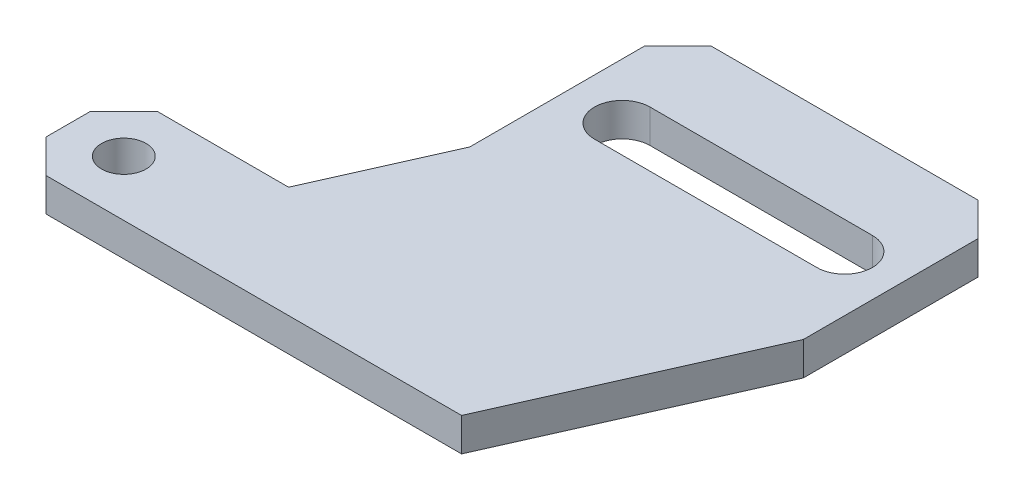
ISO-10303-21;
HEADER;
FILE_DESCRIPTION(('STEP AP214'),'2;1');
FILE_NAME('part.step','',(''),(''),'','','');
FILE_SCHEMA(('AUTOMOTIVE_DESIGN { 1 0 10303 214 1 1 1 1 }'));
ENDSEC;
DATA;
#1=APPLICATION_CONTEXT('core data for automotive mechanical design processes');
#2=APPLICATION_PROTOCOL_DEFINITION('international standard','automotive_design',2000,#1);
#3=PRODUCT_CONTEXT('',#1,'mechanical');
#4=PRODUCT('Part','Part','',(#3));
#5=PRODUCT_RELATED_PRODUCT_CATEGORY('part','',(#4));
#6=PRODUCT_DEFINITION_FORMATION('','',#4);
#7=PRODUCT_DEFINITION_CONTEXT('part definition',#1,'design');
#8=PRODUCT_DEFINITION('design','',#6,#7);
#9=PRODUCT_DEFINITION_SHAPE('','',#8);
#10=(LENGTH_UNIT() NAMED_UNIT(*) SI_UNIT(.MILLI.,.METRE.));
#11=(NAMED_UNIT(*) PLANE_ANGLE_UNIT() SI_UNIT($,.RADIAN.));
#12=(NAMED_UNIT(*) SI_UNIT($,.STERADIAN.) SOLID_ANGLE_UNIT());
#13=UNCERTAINTY_MEASURE_WITH_UNIT(LENGTH_MEASURE(1.E-05),#10,'distance_accuracy_value','');
#14=(GEOMETRIC_REPRESENTATION_CONTEXT(3) GLOBAL_UNCERTAINTY_ASSIGNED_CONTEXT((#13)) GLOBAL_UNIT_ASSIGNED_CONTEXT((#10,
#11,#12)) REPRESENTATION_CONTEXT('',''));
#15=CARTESIAN_POINT('',(0.,0.,0.));
#16=DIRECTION('',(0.,0.,1.));
#17=DIRECTION('',(1.,0.,0.));
#18=AXIS2_PLACEMENT_3D('',#15,#16,#17);
#19=CARTESIAN_POINT('',(0.,3.,0.));
#20=DIRECTION('',(0.,-1.,0.));
#21=DIRECTION('',(0.,0.,-1.));
#22=AXIS2_PLACEMENT_3D('',#19,#20,#21);
#23=PLANE('',#22);
#24=CARTESIAN_POINT('',(-29.8330840746436,3.,5.));
#25=DIRECTION('',(0.,1.,0.));
#26=DIRECTION('',(0.,0.,1.));
#27=AXIS2_PLACEMENT_3D('',#24,#25,#26);
#28=CIRCLE('',#27,2.);
#29=CARTESIAN_POINT('',(-29.8330840746436,3.,7.));
#30=VERTEX_POINT('',#29);
#31=EDGE_CURVE('E217',#30,#30,#28,.T.);
#32=ORIENTED_EDGE('',*,*,#31,.F.);
#33=EDGE_LOOP('',(#32));
#34=FACE_BOUND('',#33,.T.);
#35=DIRECTION('',(0.,0.,1.));
#36=VECTOR('',#35,1.);
#37=CARTESIAN_POINT('',(-34.8330840746436,3.,0.));
#38=LINE('',#37,#36);
#39=CARTESIAN_POINT('',(-34.8330840746436,3.,3.));
#40=VERTEX_POINT('',#39);
#41=CARTESIAN_POINT('',(-34.8330840746436,3.,6.99999999999999));
#42=VERTEX_POINT('',#41);
#43=EDGE_CURVE('E242',#40,#42,#38,.T.);
#44=ORIENTED_EDGE('',*,*,#43,.T.);
#45=DIRECTION('',(-0.707106781186545,0.,-0.70710678118655));
#46=VECTOR('',#45,1.);
#47=CARTESIAN_POINT('',(-31.8330840746436,3.,10.));
#48=LINE('',#47,#46);
#49=CARTESIAN_POINT('',(-31.8330840746436,3.,10.));
#50=VERTEX_POINT('',#49);
#51=EDGE_CURVE('E324',#42,#50,#48,.F.);
#52=ORIENTED_EDGE('',*,*,#51,.T.);
#53=DIRECTION('',(1.,0.,0.));
#54=VECTOR('',#53,1.);
#55=CARTESIAN_POINT('',(-34.8330840746436,3.,10.));
#56=LINE('',#55,#54);
#57=CARTESIAN_POINT('',(5.54714750959376,3.,10.));
#58=VERTEX_POINT('',#57);
#59=EDGE_CURVE('E246',#50,#58,#56,.T.);
#60=ORIENTED_EDGE('',*,*,#59,.T.);
#61=DIRECTION('',(0.405833681073968,0.,-0.913946947752414));
#62=VECTOR('',#61,1.);
#63=CARTESIAN_POINT('',(15.,3.,-11.2880450392829));
#64=LINE('',#63,#62);
#65=CARTESIAN_POINT('',(15.,3.,-11.2880450392829));
#66=VERTEX_POINT('',#65);
#67=EDGE_CURVE('E249',#58,#66,#64,.T.);
#68=ORIENTED_EDGE('',*,*,#67,.T.);
#69=DIRECTION('',(0.,0.,-1.));
#70=VECTOR('',#69,1.);
#71=CARTESIAN_POINT('',(15.,3.,-11.2880450392829));
#72=LINE('',#71,#70);
#73=CARTESIAN_POINT('',(15.,3.,-27.));
#74=VERTEX_POINT('',#73);
#75=EDGE_CURVE('E225',#66,#74,#72,.T.);
#76=ORIENTED_EDGE('',*,*,#75,.T.);
#77=DIRECTION('',(0.707106781186546,0.,0.707106781186549));
#78=VECTOR('',#77,1.);
#79=CARTESIAN_POINT('',(12.,3.,-30.));
#80=LINE('',#79,#78);
#81=CARTESIAN_POINT('',(12.,3.,-30.));
#82=VERTEX_POINT('',#81);
#83=EDGE_CURVE('E318',#74,#82,#80,.F.);
#84=ORIENTED_EDGE('',*,*,#83,.T.);
#85=DIRECTION('',(-1.,0.,0.));
#86=VECTOR('',#85,1.);
#87=CARTESIAN_POINT('',(-15.,3.,-30.));
#88=LINE('',#87,#86);
#89=CARTESIAN_POINT('',(-12.,3.,-30.));
#90=VERTEX_POINT('',#89);
#91=EDGE_CURVE('E229',#82,#90,#88,.T.);
#92=ORIENTED_EDGE('',*,*,#91,.T.);
#93=DIRECTION('',(0.707106781186549,0.,-0.707106781186546));
#94=VECTOR('',#93,1.);
#95=CARTESIAN_POINT('',(-15.,3.,-27.));
#96=LINE('',#95,#94);
#97=CARTESIAN_POINT('',(-15.,3.,-27.));
#98=VERTEX_POINT('',#97);
#99=EDGE_CURVE('E70',#90,#98,#96,.F.);
#100=ORIENTED_EDGE('',*,*,#99,.T.);
#101=DIRECTION('',(0.,0.,1.));
#102=VECTOR('',#101,1.);
#103=CARTESIAN_POINT('',(-15.,3.,-11.2880450392829));
#104=LINE('',#103,#102);
#105=CARTESIAN_POINT('',(-15.,3.,-11.2880450392829));
#106=VERTEX_POINT('',#105);
#107=EDGE_CURVE('E233',#98,#106,#104,.T.);
#108=ORIENTED_EDGE('',*,*,#107,.T.);
#109=DIRECTION('',(-0.405833681073968,0.,0.913946947752413));
#110=VECTOR('',#109,1.);
#111=CARTESIAN_POINT('',(-15.,3.,-11.2880450392829));
#112=LINE('',#111,#110);
#113=CARTESIAN_POINT('',(-20.0124013015052,3.,0.));
#114=VERTEX_POINT('',#113);
#115=EDGE_CURVE('E236',#106,#114,#112,.T.);
#116=ORIENTED_EDGE('',*,*,#115,.T.);
#117=DIRECTION('',(-1.,0.,0.));
#118=VECTOR('',#117,1.);
#119=CARTESIAN_POINT('',(-20.0124013015052,3.,0.));
#120=LINE('',#119,#118);
#121=CARTESIAN_POINT('',(-31.8330840746436,3.,0.));
#122=VERTEX_POINT('',#121);
#123=EDGE_CURVE('E239',#114,#122,#120,.T.);
#124=ORIENTED_EDGE('',*,*,#123,.T.);
#125=DIRECTION('',(0.707106781186548,0.,-0.707106781186547));
#126=VECTOR('',#125,1.);
#127=CARTESIAN_POINT('',(-34.8330840746436,3.,3.));
#128=LINE('',#127,#126);
#129=EDGE_CURVE('E321',#122,#40,#128,.F.);
#130=ORIENTED_EDGE('',*,*,#129,.T.);
#131=EDGE_LOOP('',(#44,#52,#60,#68,#76,#84,#92,#100,#108,#116,#124,#130));
#132=FACE_BOUND('',#131,.T.);
#133=CARTESIAN_POINT('',(-10.,3.,-20.));
#134=DIRECTION('',(0.,1.,0.));
#135=DIRECTION('',(0.,0.,1.));
#136=AXIS2_PLACEMENT_3D('',#133,#134,#135);
#137=CIRCLE('',#136,2.5);
#138=CARTESIAN_POINT('',(-10.,3.,-22.5));
#139=VERTEX_POINT('',#138);
#140=CARTESIAN_POINT('',(-10.,3.,-17.5));
#141=VERTEX_POINT('',#140);
#142=EDGE_CURVE('E164',#139,#141,#137,.T.);
#143=ORIENTED_EDGE('',*,*,#142,.F.);
#144=DIRECTION('',(-1.,0.,0.));
#145=VECTOR('',#144,1.);
#146=CARTESIAN_POINT('',(-10.,3.,-22.5));
#147=LINE('',#146,#145);
#148=CARTESIAN_POINT('',(10.,3.,-22.5));
#149=VERTEX_POINT('',#148);
#150=EDGE_CURVE('E193',#149,#139,#147,.T.);
#151=ORIENTED_EDGE('',*,*,#150,.F.);
#152=CARTESIAN_POINT('',(10.,3.,-20.));
#153=DIRECTION('',(0.,1.,0.));
#154=DIRECTION('',(0.,0.,1.));
#155=AXIS2_PLACEMENT_3D('',#152,#153,#154);
#156=CIRCLE('',#155,2.5);
#157=CARTESIAN_POINT('',(10.,3.,-17.5));
#158=VERTEX_POINT('',#157);
#159=EDGE_CURVE('E189',#158,#149,#156,.T.);
#160=ORIENTED_EDGE('',*,*,#159,.F.);
#161=DIRECTION('',(1.,0.,0.));
#162=VECTOR('',#161,1.);
#163=CARTESIAN_POINT('',(-10.,3.,-17.5));
#164=LINE('',#163,#162);
#165=EDGE_CURVE('E175',#141,#158,#164,.T.);
#166=ORIENTED_EDGE('',*,*,#165,.F.);
#167=EDGE_LOOP('',(#143,#151,#160,#166));
#168=FACE_BOUND('',#167,.T.);
#169=ADVANCED_FACE('F45',(#34,#132,#168),#23,.F.);
#170=CARTESIAN_POINT('',(0.,0.,0.));
#171=DIRECTION('',(0.,-1.,0.));
#172=DIRECTION('',(0.,0.,-1.));
#173=AXIS2_PLACEMENT_3D('',#170,#171,#172);
#174=PLANE('',#173);
#175=DIRECTION('',(1.,0.,0.));
#176=VECTOR('',#175,1.);
#177=CARTESIAN_POINT('',(-34.8330840746436,0.,10.));
#178=LINE('',#177,#176);
#179=CARTESIAN_POINT('',(-31.8330840746436,0.,10.));
#180=VERTEX_POINT('',#179);
#181=CARTESIAN_POINT('',(5.54714750959376,0.,10.));
#182=VERTEX_POINT('',#181);
#183=EDGE_CURVE('E273',#180,#182,#178,.T.);
#184=ORIENTED_EDGE('',*,*,#183,.F.);
#185=DIRECTION('',(0.707106781186545,0.,0.70710678118655));
#186=VECTOR('',#185,1.);
#187=CARTESIAN_POINT('',(-20.9165420373219,0.,20.9165420373218));
#188=LINE('',#187,#186);
#189=CARTESIAN_POINT('',(-34.8330840746436,0.,6.99999999999999));
#190=VERTEX_POINT('',#189);
#191=EDGE_CURVE('E306',#180,#190,#188,.F.);
#192=ORIENTED_EDGE('',*,*,#191,.T.);
#193=DIRECTION('',(0.,0.,1.));
#194=VECTOR('',#193,1.);
#195=CARTESIAN_POINT('',(-34.8330840746436,0.,0.));
#196=LINE('',#195,#194);
#197=CARTESIAN_POINT('',(-34.8330840746436,0.,3.));
#198=VERTEX_POINT('',#197);
#199=EDGE_CURVE('E269',#198,#190,#196,.T.);
#200=ORIENTED_EDGE('',*,*,#199,.F.);
#201=DIRECTION('',(-0.707106781186548,0.,0.707106781186547));
#202=VECTOR('',#201,1.);
#203=CARTESIAN_POINT('',(-15.9165420373218,0.,-15.9165420373218));
#204=LINE('',#203,#202);
#205=CARTESIAN_POINT('',(-31.8330840746436,0.,0.));
#206=VERTEX_POINT('',#205);
#207=EDGE_CURVE('E303',#198,#206,#204,.F.);
#208=ORIENTED_EDGE('',*,*,#207,.T.);
#209=DIRECTION('',(-1.,0.,0.));
#210=VECTOR('',#209,1.);
#211=CARTESIAN_POINT('',(-20.0124013015052,0.,0.));
#212=LINE('',#211,#210);
#213=CARTESIAN_POINT('',(-20.0124013015052,0.,0.));
#214=VERTEX_POINT('',#213);
#215=EDGE_CURVE('E266',#214,#206,#212,.T.);
#216=ORIENTED_EDGE('',*,*,#215,.F.);
#217=DIRECTION('',(-0.405833681073968,0.,0.913946947752413));
#218=VECTOR('',#217,1.);
#219=CARTESIAN_POINT('',(-15.,0.,-11.2880450392829));
#220=LINE('',#219,#218);
#221=CARTESIAN_POINT('',(-15.,0.,-11.2880450392829));
#222=VERTEX_POINT('',#221);
#223=EDGE_CURVE('E263',#222,#214,#220,.T.);
#224=ORIENTED_EDGE('',*,*,#223,.F.);
#225=DIRECTION('',(0.,0.,1.));
#226=VECTOR('',#225,1.);
#227=CARTESIAN_POINT('',(-15.,0.,-11.2880450392829));
#228=LINE('',#227,#226);
#229=CARTESIAN_POINT('',(-15.,0.,-27.));
#230=VERTEX_POINT('',#229);
#231=EDGE_CURVE('E260',#230,#222,#228,.T.);
#232=ORIENTED_EDGE('',*,*,#231,.F.);
#233=DIRECTION('',(-0.707106781186549,0.,0.707106781186546));
#234=VECTOR('',#233,1.);
#235=CARTESIAN_POINT('',(-21.,0.,-21.0000000000001));
#236=LINE('',#235,#234);
#237=CARTESIAN_POINT('',(-12.,0.,-30.));
#238=VERTEX_POINT('',#237);
#239=EDGE_CURVE('E297',#230,#238,#236,.F.);
#240=ORIENTED_EDGE('',*,*,#239,.T.);
#241=DIRECTION('',(-1.,0.,0.));
#242=VECTOR('',#241,1.);
#243=CARTESIAN_POINT('',(-15.,0.,-30.));
#244=LINE('',#243,#242);
#245=CARTESIAN_POINT('',(12.,0.,-30.));
#246=VERTEX_POINT('',#245);
#247=EDGE_CURVE('E256',#246,#238,#244,.T.);
#248=ORIENTED_EDGE('',*,*,#247,.F.);
#249=DIRECTION('',(-0.707106781186546,0.,-0.707106781186549));
#250=VECTOR('',#249,1.);
#251=CARTESIAN_POINT('',(21.,0.,-20.9999999999999));
#252=LINE('',#251,#250);
#253=CARTESIAN_POINT('',(15.,0.,-27.));
#254=VERTEX_POINT('',#253);
#255=EDGE_CURVE('E300',#246,#254,#252,.F.);
#256=ORIENTED_EDGE('',*,*,#255,.T.);
#257=DIRECTION('',(0.,0.,-1.));
#258=VECTOR('',#257,1.);
#259=CARTESIAN_POINT('',(15.,0.,-11.2880450392829));
#260=LINE('',#259,#258);
#261=CARTESIAN_POINT('',(15.,0.,-11.2880450392829));
#262=VERTEX_POINT('',#261);
#263=EDGE_CURVE('E221',#262,#254,#260,.T.);
#264=ORIENTED_EDGE('',*,*,#263,.F.);
#265=DIRECTION('',(0.405833681073968,0.,-0.913946947752414));
#266=VECTOR('',#265,1.);
#267=CARTESIAN_POINT('',(15.,0.,-11.2880450392829));
#268=LINE('',#267,#266);
#269=EDGE_CURVE('E230',#182,#262,#268,.T.);
#270=ORIENTED_EDGE('',*,*,#269,.F.);
#271=EDGE_LOOP('',(#184,#192,#200,#208,#216,#224,#232,#240,#248,#256,#264,#270));
#272=FACE_BOUND('',#271,.T.);
#273=CARTESIAN_POINT('',(-29.8330840746436,0.,5.));
#274=DIRECTION('',(0.,1.,0.));
#275=DIRECTION('',(0.,0.,1.));
#276=AXIS2_PLACEMENT_3D('',#273,#274,#275);
#277=CIRCLE('',#276,2.);
#278=CARTESIAN_POINT('',(-29.8330840746436,0.,7.));
#279=VERTEX_POINT('',#278);
#280=EDGE_CURVE('E184',#279,#279,#277,.T.);
#281=ORIENTED_EDGE('',*,*,#280,.T.);
#282=EDGE_LOOP('',(#281));
#283=FACE_BOUND('',#282,.T.);
#284=DIRECTION('',(-1.,0.,0.));
#285=VECTOR('',#284,1.);
#286=CARTESIAN_POINT('',(-10.,0.,-22.5));
#287=LINE('',#286,#285);
#288=CARTESIAN_POINT('',(10.,0.,-22.5));
#289=VERTEX_POINT('',#288);
#290=CARTESIAN_POINT('',(-10.,0.,-22.5));
#291=VERTEX_POINT('',#290);
#292=EDGE_CURVE('E176',#289,#291,#287,.T.);
#293=ORIENTED_EDGE('',*,*,#292,.T.);
#294=CARTESIAN_POINT('',(-10.,0.,-20.));
#295=DIRECTION('',(0.,1.,0.));
#296=DIRECTION('',(0.,0.,1.));
#297=AXIS2_PLACEMENT_3D('',#294,#295,#296);
#298=CIRCLE('',#297,2.5);
#299=CARTESIAN_POINT('',(-10.,0.,-17.5));
#300=VERTEX_POINT('',#299);
#301=EDGE_CURVE('E198',#291,#300,#298,.T.);
#302=ORIENTED_EDGE('',*,*,#301,.T.);
#303=DIRECTION('',(1.,0.,0.));
#304=VECTOR('',#303,1.);
#305=CARTESIAN_POINT('',(-10.,0.,-17.5));
#306=LINE('',#305,#304);
#307=CARTESIAN_POINT('',(10.,0.,-17.5));
#308=VERTEX_POINT('',#307);
#309=EDGE_CURVE('E182',#300,#308,#306,.T.);
#310=ORIENTED_EDGE('',*,*,#309,.T.);
#311=CARTESIAN_POINT('',(10.,0.,-20.));
#312=DIRECTION('',(0.,1.,0.));
#313=DIRECTION('',(0.,0.,1.));
#314=AXIS2_PLACEMENT_3D('',#311,#312,#313);
#315=CIRCLE('',#314,2.5);
#316=EDGE_CURVE('E203',#308,#289,#315,.T.);
#317=ORIENTED_EDGE('',*,*,#316,.T.);
#318=EDGE_LOOP('',(#293,#302,#310,#317));
#319=FACE_BOUND('',#318,.T.);
#320=ADVANCED_FACE('F354',(#272,#283,#319),#174,.T.);
#321=CARTESIAN_POINT('',(15.,3.,-11.2880450392829));
#322=DIRECTION('',(-1.,0.,0.));
#323=DIRECTION('',(0.,0.,1.));
#324=AXIS2_PLACEMENT_3D('',#321,#322,#323);
#325=PLANE('',#324);
#326=ORIENTED_EDGE('',*,*,#263,.T.);
#327=DIRECTION('',(0.,1.,0.));
#328=VECTOR('',#327,1.);
#329=CARTESIAN_POINT('',(15.,3.,-27.));
#330=LINE('',#329,#328);
#331=EDGE_CURVE('E55',#254,#74,#330,.T.);
#332=ORIENTED_EDGE('',*,*,#331,.T.);
#333=ORIENTED_EDGE('',*,*,#75,.F.);
#334=DIRECTION('',(0.,-1.,0.));
#335=VECTOR('',#334,1.);
#336=CARTESIAN_POINT('',(15.,3.,-11.2880450392829));
#337=LINE('',#336,#335);
#338=EDGE_CURVE('E252',#66,#262,#337,.T.);
#339=ORIENTED_EDGE('',*,*,#338,.T.);
#340=EDGE_LOOP('',(#326,#332,#333,#339));
#341=FACE_BOUND('',#340,.T.);
#342=ADVANCED_FACE('F339',(#341),#325,.F.);
#343=CARTESIAN_POINT('',(-15.,3.,-30.));
#344=DIRECTION('',(0.,0.,1.));
#345=DIRECTION('',(1.,0.,0.));
#346=AXIS2_PLACEMENT_3D('',#343,#344,#345);
#347=PLANE('',#346);
#348=ORIENTED_EDGE('',*,*,#91,.F.);
#349=DIRECTION('',(0.,-1.,0.));
#350=VECTOR('',#349,1.);
#351=CARTESIAN_POINT('',(12.,3.,-30.));
#352=LINE('',#351,#350);
#353=EDGE_CURVE('E332',#82,#246,#352,.T.);
#354=ORIENTED_EDGE('',*,*,#353,.T.);
#355=ORIENTED_EDGE('',*,*,#247,.T.);
#356=DIRECTION('',(0.,1.,0.));
#357=VECTOR('',#356,1.);
#358=CARTESIAN_POINT('',(-12.,3.,-30.));
#359=LINE('',#358,#357);
#360=EDGE_CURVE('E329',#238,#90,#359,.T.);
#361=ORIENTED_EDGE('',*,*,#360,.T.);
#362=EDGE_LOOP('',(#348,#354,#355,#361));
#363=FACE_BOUND('',#362,.T.);
#364=ADVANCED_FACE('F350',(#363),#347,.F.);
#365=CARTESIAN_POINT('',(-15.,3.,-11.2880450392829));
#366=DIRECTION('',(1.,0.,0.));
#367=DIRECTION('',(0.,0.,-1.));
#368=AXIS2_PLACEMENT_3D('',#365,#366,#367);
#369=PLANE('',#368);
#370=ORIENTED_EDGE('',*,*,#107,.F.);
#371=DIRECTION('',(0.,-1.,0.));
#372=VECTOR('',#371,1.);
#373=CARTESIAN_POINT('',(-15.,3.,-27.));
#374=LINE('',#373,#372);
#375=EDGE_CURVE('E11',#98,#230,#374,.T.);
#376=ORIENTED_EDGE('',*,*,#375,.T.);
#377=ORIENTED_EDGE('',*,*,#231,.T.);
#378=DIRECTION('',(0.,-1.,0.));
#379=VECTOR('',#378,1.);
#380=CARTESIAN_POINT('',(-15.,3.,-11.2880450392829));
#381=LINE('',#380,#379);
#382=EDGE_CURVE('E289',#106,#222,#381,.T.);
#383=ORIENTED_EDGE('',*,*,#382,.F.);
#384=EDGE_LOOP('',(#370,#376,#377,#383));
#385=FACE_BOUND('',#384,.T.);
#386=ADVANCED_FACE('F361',(#385),#369,.F.);
#387=CARTESIAN_POINT('',(-15.,3.,-11.2880450392829));
#388=DIRECTION('',(0.913946947752413,0.,0.405833681073968));
#389=DIRECTION('',(0.405833681073968,0.,-0.913946947752414));
#390=AXIS2_PLACEMENT_3D('',#387,#388,#389);
#391=PLANE('',#390);
#392=ORIENTED_EDGE('',*,*,#223,.T.);
#393=DIRECTION('',(0.,-1.,0.));
#394=VECTOR('',#393,1.);
#395=CARTESIAN_POINT('',(-20.0124013015052,3.,0.));
#396=LINE('',#395,#394);
#397=EDGE_CURVE('E285',#114,#214,#396,.T.);
#398=ORIENTED_EDGE('',*,*,#397,.F.);
#399=ORIENTED_EDGE('',*,*,#115,.F.);
#400=ORIENTED_EDGE('',*,*,#382,.T.);
#401=EDGE_LOOP('',(#392,#398,#399,#400));
#402=FACE_BOUND('',#401,.T.);
#403=ADVANCED_FACE('F367',(#402),#391,.F.);
#404=CARTESIAN_POINT('',(-20.0124013015052,3.,0.));
#405=DIRECTION('',(0.,0.,1.));
#406=DIRECTION('',(1.,0.,0.));
#407=AXIS2_PLACEMENT_3D('',#404,#405,#406);
#408=PLANE('',#407);
#409=ORIENTED_EDGE('',*,*,#215,.T.);
#410=DIRECTION('',(0.,1.,0.));
#411=VECTOR('',#410,1.);
#412=CARTESIAN_POINT('',(-31.8330840746436,3.,0.));
#413=LINE('',#412,#411);
#414=EDGE_CURVE('E62',#206,#122,#413,.T.);
#415=ORIENTED_EDGE('',*,*,#414,.T.);
#416=ORIENTED_EDGE('',*,*,#123,.F.);
#417=ORIENTED_EDGE('',*,*,#397,.T.);
#418=EDGE_LOOP('',(#409,#415,#416,#417));
#419=FACE_BOUND('',#418,.T.);
#420=ADVANCED_FACE('F369',(#419),#408,.F.);
#421=CARTESIAN_POINT('',(-34.8330840746436,3.,0.));
#422=DIRECTION('',(1.,0.,0.));
#423=DIRECTION('',(0.,0.,-1.));
#424=AXIS2_PLACEMENT_3D('',#421,#422,#423);
#425=PLANE('',#424);
#426=ORIENTED_EDGE('',*,*,#199,.T.);
#427=DIRECTION('',(0.,1.,0.));
#428=VECTOR('',#427,1.);
#429=CARTESIAN_POINT('',(-34.8330840746436,3.,6.99999999999999));
#430=LINE('',#429,#428);
#431=EDGE_CURVE('E313',#190,#42,#430,.T.);
#432=ORIENTED_EDGE('',*,*,#431,.T.);
#433=ORIENTED_EDGE('',*,*,#43,.F.);
#434=DIRECTION('',(0.,-1.,0.));
#435=VECTOR('',#434,1.);
#436=CARTESIAN_POINT('',(-34.8330840746436,3.,3.));
#437=LINE('',#436,#435);
#438=EDGE_CURVE('E309',#40,#198,#437,.T.);
#439=ORIENTED_EDGE('',*,*,#438,.T.);
#440=EDGE_LOOP('',(#426,#432,#433,#439));
#441=FACE_BOUND('',#440,.T.);
#442=ADVANCED_FACE('F371',(#441),#425,.F.);
#443=CARTESIAN_POINT('',(-34.8330840746436,3.,10.));
#444=DIRECTION('',(0.,0.,-1.));
#445=DIRECTION('',(-1.,0.,0.));
#446=AXIS2_PLACEMENT_3D('',#443,#444,#445);
#447=PLANE('',#446);
#448=ORIENTED_EDGE('',*,*,#59,.F.);
#449=DIRECTION('',(0.,-1.,0.));
#450=VECTOR('',#449,1.);
#451=CARTESIAN_POINT('',(-31.8330840746436,3.,10.));
#452=LINE('',#451,#450);
#453=EDGE_CURVE('E293',#50,#180,#452,.T.);
#454=ORIENTED_EDGE('',*,*,#453,.T.);
#455=ORIENTED_EDGE('',*,*,#183,.T.);
#456=DIRECTION('',(0.,-1.,0.));
#457=VECTOR('',#456,1.);
#458=CARTESIAN_POINT('',(5.54714750959376,3.,10.));
#459=LINE('',#458,#457);
#460=EDGE_CURVE('E281',#58,#182,#459,.T.);
#461=ORIENTED_EDGE('',*,*,#460,.F.);
#462=EDGE_LOOP('',(#448,#454,#455,#461));
#463=FACE_BOUND('',#462,.T.);
#464=ADVANCED_FACE('F377',(#463),#447,.F.);
#465=CARTESIAN_POINT('',(15.,3.,-11.2880450392829));
#466=DIRECTION('',(-0.913946947752414,0.,-0.405833681073968));
#467=DIRECTION('',(-0.405833681073968,0.,0.913946947752414));
#468=AXIS2_PLACEMENT_3D('',#465,#466,#467);
#469=PLANE('',#468);
#470=ORIENTED_EDGE('',*,*,#269,.T.);
#471=ORIENTED_EDGE('',*,*,#338,.F.);
#472=ORIENTED_EDGE('',*,*,#67,.F.);
#473=ORIENTED_EDGE('',*,*,#460,.T.);
#474=EDGE_LOOP('',(#470,#471,#472,#473));
#475=FACE_BOUND('',#474,.T.);
#476=ADVANCED_FACE('F393',(#475),#469,.F.);
#477=CARTESIAN_POINT('',(-29.8330840746436,3.,5.));
#478=DIRECTION('',(0.,-1.,0.));
#479=DIRECTION('',(0.,0.,-1.));
#480=AXIS2_PLACEMENT_3D('',#477,#478,#479);
#481=CYLINDRICAL_SURFACE('',#480,2.);
#482=ORIENTED_EDGE('',*,*,#31,.T.);
#483=EDGE_LOOP('',(#482));
#484=FACE_BOUND('',#483,.T.);
#485=ORIENTED_EDGE('',*,*,#280,.F.);
#486=EDGE_LOOP('',(#485));
#487=FACE_BOUND('',#486,.T.);
#488=ADVANCED_FACE('F390',(#484,#487),#481,.F.);
#489=CARTESIAN_POINT('',(-10.,3.,-20.));
#490=DIRECTION('',(0.,-1.,0.));
#491=DIRECTION('',(0.,0.,-1.));
#492=AXIS2_PLACEMENT_3D('',#489,#490,#491);
#493=CYLINDRICAL_SURFACE('',#492,2.5);
#494=ORIENTED_EDGE('',*,*,#301,.F.);
#495=DIRECTION('',(0.,-1.,0.));
#496=VECTOR('',#495,1.);
#497=CARTESIAN_POINT('',(-10.,3.,-22.5));
#498=LINE('',#497,#496);
#499=EDGE_CURVE('E170',#139,#291,#498,.T.);
#500=ORIENTED_EDGE('',*,*,#499,.F.);
#501=ORIENTED_EDGE('',*,*,#142,.T.);
#502=DIRECTION('',(0.,-1.,0.));
#503=VECTOR('',#502,1.);
#504=CARTESIAN_POINT('',(-10.,3.,-17.5));
#505=LINE('',#504,#503);
#506=EDGE_CURVE('E167',#141,#300,#505,.T.);
#507=ORIENTED_EDGE('',*,*,#506,.T.);
#508=EDGE_LOOP('',(#494,#500,#501,#507));
#509=FACE_BOUND('',#508,.T.);
#510=ADVANCED_FACE('F166',(#509),#493,.F.);
#511=CARTESIAN_POINT('',(-10.,3.,-17.5));
#512=DIRECTION('',(0.,0.,-1.));
#513=DIRECTION('',(-1.,0.,0.));
#514=AXIS2_PLACEMENT_3D('',#511,#512,#513);
#515=PLANE('',#514);
#516=ORIENTED_EDGE('',*,*,#309,.F.);
#517=ORIENTED_EDGE('',*,*,#506,.F.);
#518=ORIENTED_EDGE('',*,*,#165,.T.);
#519=DIRECTION('',(0.,-1.,0.));
#520=VECTOR('',#519,1.);
#521=CARTESIAN_POINT('',(10.,3.,-17.5));
#522=LINE('',#521,#520);
#523=EDGE_CURVE('E185',#158,#308,#522,.T.);
#524=ORIENTED_EDGE('',*,*,#523,.T.);
#525=EDGE_LOOP('',(#516,#517,#518,#524));
#526=FACE_BOUND('',#525,.T.);
#527=ADVANCED_FACE('F179',(#526),#515,.T.);
#528=CARTESIAN_POINT('',(10.,3.,-20.));
#529=DIRECTION('',(0.,-1.,0.));
#530=DIRECTION('',(0.,0.,-1.));
#531=AXIS2_PLACEMENT_3D('',#528,#529,#530);
#532=CYLINDRICAL_SURFACE('',#531,2.5);
#533=ORIENTED_EDGE('',*,*,#316,.F.);
#534=ORIENTED_EDGE('',*,*,#523,.F.);
#535=ORIENTED_EDGE('',*,*,#159,.T.);
#536=DIRECTION('',(0.,-1.,0.));
#537=VECTOR('',#536,1.);
#538=CARTESIAN_POINT('',(10.,3.,-22.5));
#539=LINE('',#538,#537);
#540=EDGE_CURVE('E212',#149,#289,#539,.T.);
#541=ORIENTED_EDGE('',*,*,#540,.T.);
#542=EDGE_LOOP('',(#533,#534,#535,#541));
#543=FACE_BOUND('',#542,.T.);
#544=ADVANCED_FACE('F483',(#543),#532,.F.);
#545=CARTESIAN_POINT('',(-10.,3.,-22.5));
#546=DIRECTION('',(0.,0.,1.));
#547=DIRECTION('',(1.,0.,0.));
#548=AXIS2_PLACEMENT_3D('',#545,#546,#547);
#549=PLANE('',#548);
#550=ORIENTED_EDGE('',*,*,#292,.F.);
#551=ORIENTED_EDGE('',*,*,#540,.F.);
#552=ORIENTED_EDGE('',*,*,#150,.T.);
#553=ORIENTED_EDGE('',*,*,#499,.T.);
#554=EDGE_LOOP('',(#550,#551,#552,#553));
#555=FACE_BOUND('',#554,.T.);
#556=ADVANCED_FACE('F420',(#555),#549,.T.);
#557=CARTESIAN_POINT('',(-31.8330840746436,3.,10.));
#558=DIRECTION('',(0.70710678118655,0.,-0.707106781186545));
#559=DIRECTION('',(0.,-1.,0.));
#560=AXIS2_PLACEMENT_3D('',#557,#558,#559);
#561=PLANE('',#560);
#562=ORIENTED_EDGE('',*,*,#51,.F.);
#563=ORIENTED_EDGE('',*,*,#431,.F.);
#564=ORIENTED_EDGE('',*,*,#191,.F.);
#565=ORIENTED_EDGE('',*,*,#453,.F.);
#566=EDGE_LOOP('',(#562,#563,#564,#565));
#567=FACE_BOUND('',#566,.T.);
#568=ADVANCED_FACE('F406',(#567),#561,.F.);
#569=CARTESIAN_POINT('',(-34.8330840746436,3.,3.));
#570=DIRECTION('',(0.707106781186547,0.,0.707106781186548));
#571=DIRECTION('',(0.,-1.,0.));
#572=AXIS2_PLACEMENT_3D('',#569,#570,#571);
#573=PLANE('',#572);
#574=ORIENTED_EDGE('',*,*,#129,.F.);
#575=ORIENTED_EDGE('',*,*,#414,.F.);
#576=ORIENTED_EDGE('',*,*,#207,.F.);
#577=ORIENTED_EDGE('',*,*,#438,.F.);
#578=EDGE_LOOP('',(#574,#575,#576,#577));
#579=FACE_BOUND('',#578,.T.);
#580=ADVANCED_FACE('F413',(#579),#573,.F.);
#581=CARTESIAN_POINT('',(12.,3.,-30.));
#582=DIRECTION('',(-0.707106781186549,0.,0.707106781186546));
#583=DIRECTION('',(0.,-1.,0.));
#584=AXIS2_PLACEMENT_3D('',#581,#582,#583);
#585=PLANE('',#584);
#586=ORIENTED_EDGE('',*,*,#83,.F.);
#587=ORIENTED_EDGE('',*,*,#331,.F.);
#588=ORIENTED_EDGE('',*,*,#255,.F.);
#589=ORIENTED_EDGE('',*,*,#353,.F.);
#590=EDGE_LOOP('',(#586,#587,#588,#589));
#591=FACE_BOUND('',#590,.T.);
#592=ADVANCED_FACE('F347',(#591),#585,.F.);
#593=CARTESIAN_POINT('',(-15.,3.,-27.));
#594=DIRECTION('',(0.707106781186546,0.,0.707106781186549));
#595=DIRECTION('',(0.,-1.,0.));
#596=AXIS2_PLACEMENT_3D('',#593,#594,#595);
#597=PLANE('',#596);
#598=ORIENTED_EDGE('',*,*,#99,.F.);
#599=ORIENTED_EDGE('',*,*,#360,.F.);
#600=ORIENTED_EDGE('',*,*,#239,.F.);
#601=ORIENTED_EDGE('',*,*,#375,.F.);
#602=EDGE_LOOP('',(#598,#599,#600,#601));
#603=FACE_BOUND('',#602,.T.);
#604=ADVANCED_FACE('F48',(#603),#597,.F.);
#605=CLOSED_SHELL('',(#169,#320,#342,#364,#386,#403,#420,#442,#464,#476,#488,#510,#527,#544,
#556,#568,#580,#592,#604));
#606=MANIFOLD_SOLID_BREP('B2',#605);
#607=ADVANCED_BREP_SHAPE_REPRESENTATION('',(#18,#606),#14);
#608=SHAPE_DEFINITION_REPRESENTATION(#9,#607);
ENDSEC;
END-ISO-10303-21;
